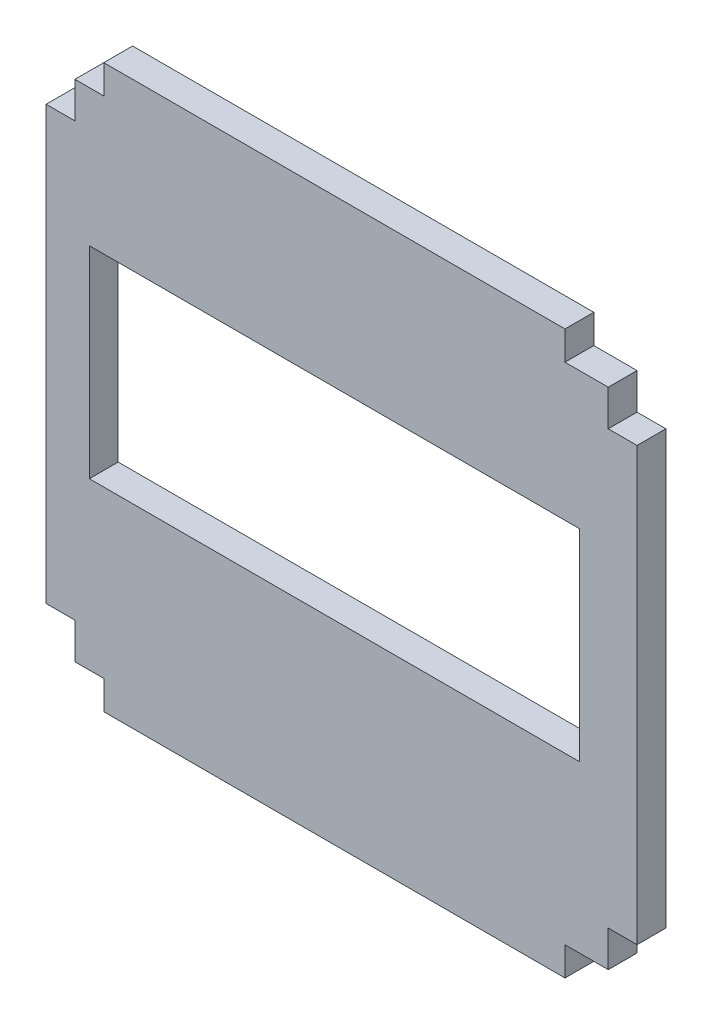
ISO-10303-21;
HEADER;
FILE_DESCRIPTION(('STEP AP214'),'2;1');
FILE_NAME('part.step','',(''),(''),'','','');
FILE_SCHEMA(('AUTOMOTIVE_DESIGN { 1 0 10303 214 1 1 1 1 }'));
ENDSEC;
DATA;
#1=APPLICATION_CONTEXT('core data for automotive mechanical design processes');
#2=APPLICATION_PROTOCOL_DEFINITION('international standard','automotive_design',2000,#1);
#3=PRODUCT_CONTEXT('',#1,'mechanical');
#4=PRODUCT('Part','Part','',(#3));
#5=PRODUCT_RELATED_PRODUCT_CATEGORY('part','',(#4));
#6=PRODUCT_DEFINITION_FORMATION('','',#4);
#7=PRODUCT_DEFINITION_CONTEXT('part definition',#1,'design');
#8=PRODUCT_DEFINITION('design','',#6,#7);
#9=PRODUCT_DEFINITION_SHAPE('','',#8);
#10=(LENGTH_UNIT() NAMED_UNIT(*) SI_UNIT(.MILLI.,.METRE.));
#11=(NAMED_UNIT(*) PLANE_ANGLE_UNIT() SI_UNIT($,.RADIAN.));
#12=(NAMED_UNIT(*) SI_UNIT($,.STERADIAN.) SOLID_ANGLE_UNIT());
#13=UNCERTAINTY_MEASURE_WITH_UNIT(LENGTH_MEASURE(1.E-05),#10,'distance_accuracy_value','');
#14=(GEOMETRIC_REPRESENTATION_CONTEXT(3) GLOBAL_UNCERTAINTY_ASSIGNED_CONTEXT((#13)) GLOBAL_UNIT_ASSIGNED_CONTEXT((#10,
#11,#12)) REPRESENTATION_CONTEXT('',''));
#15=CARTESIAN_POINT('',(0.,0.,0.));
#16=DIRECTION('',(0.,0.,1.));
#17=DIRECTION('',(1.,0.,0.));
#18=AXIS2_PLACEMENT_3D('',#15,#16,#17);
#19=CARTESIAN_POINT('',(0.,0.,2.));
#20=DIRECTION('',(0.,0.,-1.));
#21=DIRECTION('',(-1.,0.,0.));
#22=AXIS2_PLACEMENT_3D('',#19,#20,#21);
#23=PLANE('',#22);
#24=DIRECTION('',(0.,1.,0.));
#25=VECTOR('',#24,1.);
#26=CARTESIAN_POINT('',(37.,-32.5,2.));
#27=LINE('',#26,#25);
#28=CARTESIAN_POINT('',(37.,-35.,2.));
#29=VERTEX_POINT('',#28);
#30=CARTESIAN_POINT('',(37.,-32.5,2.));
#31=VERTEX_POINT('',#30);
#32=EDGE_CURVE('E231',#29,#31,#27,.T.);
#33=ORIENTED_EDGE('',*,*,#32,.T.);
#34=DIRECTION('',(1.,0.,0.));
#35=VECTOR('',#34,1.);
#36=CARTESIAN_POINT('',(37.,-32.5,2.));
#37=LINE('',#36,#35);
#38=CARTESIAN_POINT('',(39.,-32.5,2.));
#39=VERTEX_POINT('',#38);
#40=EDGE_CURVE('E234',#31,#39,#37,.T.);
#41=ORIENTED_EDGE('',*,*,#40,.T.);
#42=DIRECTION('',(0.,1.,0.));
#43=VECTOR('',#42,1.);
#44=CARTESIAN_POINT('',(39.,-32.5,2.));
#45=LINE('',#44,#43);
#46=CARTESIAN_POINT('',(39.,-2.5,2.));
#47=VERTEX_POINT('',#46);
#48=EDGE_CURVE('E237',#39,#47,#45,.T.);
#49=ORIENTED_EDGE('',*,*,#48,.T.);
#50=DIRECTION('',(-1.,0.,0.));
#51=VECTOR('',#50,1.);
#52=CARTESIAN_POINT('',(37.,-2.5,2.));
#53=LINE('',#52,#51);
#54=CARTESIAN_POINT('',(37.,-2.5,2.));
#55=VERTEX_POINT('',#54);
#56=EDGE_CURVE('E239',#47,#55,#53,.T.);
#57=ORIENTED_EDGE('',*,*,#56,.T.);
#58=DIRECTION('',(0.,1.,0.));
#59=VECTOR('',#58,1.);
#60=CARTESIAN_POINT('',(37.,-2.5,2.));
#61=LINE('',#60,#59);
#62=CARTESIAN_POINT('',(37.,0.,2.));
#63=VERTEX_POINT('',#62);
#64=EDGE_CURVE('E241',#55,#63,#61,.T.);
#65=ORIENTED_EDGE('',*,*,#64,.T.);
#66=DIRECTION('',(-1.,0.,0.));
#67=VECTOR('',#66,1.);
#68=CARTESIAN_POINT('',(37.,0.,2.));
#69=LINE('',#68,#67);
#70=CARTESIAN_POINT('',(34.,0.,2.));
#71=VERTEX_POINT('',#70);
#72=EDGE_CURVE('E243',#63,#71,#69,.T.);
#73=ORIENTED_EDGE('',*,*,#72,.T.);
#74=DIRECTION('',(0.,1.,0.));
#75=VECTOR('',#74,1.);
#76=CARTESIAN_POINT('',(34.,2.00000000000001,2.));
#77=LINE('',#76,#75);
#78=CARTESIAN_POINT('',(34.,2.00000000000001,2.));
#79=VERTEX_POINT('',#78);
#80=EDGE_CURVE('E245',#71,#79,#77,.T.);
#81=ORIENTED_EDGE('',*,*,#80,.T.);
#82=DIRECTION('',(-1.,0.,0.));
#83=VECTOR('',#82,1.);
#84=CARTESIAN_POINT('',(2.,2.00000000000001,2.));
#85=LINE('',#84,#83);
#86=CARTESIAN_POINT('',(2.,2.00000000000001,2.));
#87=VERTEX_POINT('',#86);
#88=EDGE_CURVE('E247',#79,#87,#85,.T.);
#89=ORIENTED_EDGE('',*,*,#88,.T.);
#90=DIRECTION('',(0.,-1.,0.));
#91=VECTOR('',#90,1.);
#92=CARTESIAN_POINT('',(2.,0.,2.));
#93=LINE('',#92,#91);
#94=CARTESIAN_POINT('',(2.,0.,2.));
#95=VERTEX_POINT('',#94);
#96=EDGE_CURVE('E249',#87,#95,#93,.T.);
#97=ORIENTED_EDGE('',*,*,#96,.T.);
#98=DIRECTION('',(-1.,0.,0.));
#99=VECTOR('',#98,1.);
#100=CARTESIAN_POINT('',(0.,0.,2.));
#101=LINE('',#100,#99);
#102=CARTESIAN_POINT('',(0.,0.,2.));
#103=VERTEX_POINT('',#102);
#104=EDGE_CURVE('E251',#95,#103,#101,.T.);
#105=ORIENTED_EDGE('',*,*,#104,.T.);
#106=DIRECTION('',(0.,-1.,0.));
#107=VECTOR('',#106,1.);
#108=CARTESIAN_POINT('',(0.,0.,2.));
#109=LINE('',#108,#107);
#110=CARTESIAN_POINT('',(0.,-2.5,2.));
#111=VERTEX_POINT('',#110);
#112=EDGE_CURVE('E253',#103,#111,#109,.T.);
#113=ORIENTED_EDGE('',*,*,#112,.T.);
#114=DIRECTION('',(-1.,0.,0.));
#115=VECTOR('',#114,1.);
#116=CARTESIAN_POINT('',(0.,-2.5,2.));
#117=LINE('',#116,#115);
#118=CARTESIAN_POINT('',(-2.,-2.5,2.));
#119=VERTEX_POINT('',#118);
#120=EDGE_CURVE('E255',#111,#119,#117,.T.);
#121=ORIENTED_EDGE('',*,*,#120,.T.);
#122=DIRECTION('',(0.,-1.,0.));
#123=VECTOR('',#122,1.);
#124=CARTESIAN_POINT('',(-2.,-2.5,2.));
#125=LINE('',#124,#123);
#126=CARTESIAN_POINT('',(-2.,-32.5,2.));
#127=VERTEX_POINT('',#126);
#128=EDGE_CURVE('E257',#119,#127,#125,.T.);
#129=ORIENTED_EDGE('',*,*,#128,.T.);
#130=DIRECTION('',(1.,0.,0.));
#131=VECTOR('',#130,1.);
#132=CARTESIAN_POINT('',(0.,-32.5,2.));
#133=LINE('',#132,#131);
#134=CARTESIAN_POINT('',(0.,-32.5,2.));
#135=VERTEX_POINT('',#134);
#136=EDGE_CURVE('E259',#127,#135,#133,.T.);
#137=ORIENTED_EDGE('',*,*,#136,.T.);
#138=DIRECTION('',(0.,-1.,0.));
#139=VECTOR('',#138,1.);
#140=CARTESIAN_POINT('',(0.,-35.,2.));
#141=LINE('',#140,#139);
#142=CARTESIAN_POINT('',(0.,-35.,2.));
#143=VERTEX_POINT('',#142);
#144=EDGE_CURVE('E261',#135,#143,#141,.T.);
#145=ORIENTED_EDGE('',*,*,#144,.T.);
#146=DIRECTION('',(1.,0.,0.));
#147=VECTOR('',#146,1.);
#148=CARTESIAN_POINT('',(0.,-35.,2.));
#149=LINE('',#148,#147);
#150=CARTESIAN_POINT('',(2.,-35.,2.));
#151=VERTEX_POINT('',#150);
#152=EDGE_CURVE('E263',#143,#151,#149,.T.);
#153=ORIENTED_EDGE('',*,*,#152,.T.);
#154=DIRECTION('',(0.,-1.,0.));
#155=VECTOR('',#154,1.);
#156=CARTESIAN_POINT('',(2.,-35.,2.));
#157=LINE('',#156,#155);
#158=CARTESIAN_POINT('',(2.,-37.,2.));
#159=VERTEX_POINT('',#158);
#160=EDGE_CURVE('E265',#151,#159,#157,.T.);
#161=ORIENTED_EDGE('',*,*,#160,.T.);
#162=DIRECTION('',(1.,0.,0.));
#163=VECTOR('',#162,1.);
#164=CARTESIAN_POINT('',(2.,-37.,2.));
#165=LINE('',#164,#163);
#166=CARTESIAN_POINT('',(34.,-37.,2.));
#167=VERTEX_POINT('',#166);
#168=EDGE_CURVE('E267',#159,#167,#165,.T.);
#169=ORIENTED_EDGE('',*,*,#168,.T.);
#170=DIRECTION('',(0.,1.,0.));
#171=VECTOR('',#170,1.);
#172=CARTESIAN_POINT('',(34.,-37.,2.));
#173=LINE('',#172,#171);
#174=CARTESIAN_POINT('',(34.,-35.,2.));
#175=VERTEX_POINT('',#174);
#176=EDGE_CURVE('E269',#167,#175,#173,.T.);
#177=ORIENTED_EDGE('',*,*,#176,.T.);
#178=DIRECTION('',(1.,0.,0.));
#179=VECTOR('',#178,1.);
#180=CARTESIAN_POINT('',(37.,-35.,2.));
#181=LINE('',#180,#179);
#182=EDGE_CURVE('E271',#175,#29,#181,.T.);
#183=ORIENTED_EDGE('',*,*,#182,.T.);
#184=EDGE_LOOP('',(#33,#41,#49,#57,#65,#73,#81,#89,#97,#105,#113,#121,#129,#137,#145,#153,#161,
#169,#177,#183));
#185=FACE_BOUND('',#184,.T.);
#186=DIRECTION('',(-1.,0.,0.));
#187=VECTOR('',#186,1.);
#188=CARTESIAN_POINT('',(35.0000000000001,-9.50000000000026,2.));
#189=LINE('',#188,#187);
#190=CARTESIAN_POINT('',(35.0000000000001,-9.50000000000026,2.));
#191=VERTEX_POINT('',#190);
#192=CARTESIAN_POINT('',(1.00000000000052,-9.50000000000026,2.));
#193=VERTEX_POINT('',#192);
#194=EDGE_CURVE('E198',#191,#193,#189,.T.);
#195=ORIENTED_EDGE('',*,*,#194,.F.);
#196=DIRECTION('',(0.,1.,0.));
#197=VECTOR('',#196,1.);
#198=CARTESIAN_POINT('',(35.0000000000001,-11.5000000000003,2.));
#199=LINE('',#198,#197);
#200=CARTESIAN_POINT('',(35.0000000000001,-23.5000000000002,2.));
#201=VERTEX_POINT('',#200);
#202=EDGE_CURVE('E193',#201,#191,#199,.T.);
#203=ORIENTED_EDGE('',*,*,#202,.F.);
#204=DIRECTION('',(1.,0.,0.));
#205=VECTOR('',#204,1.);
#206=CARTESIAN_POINT('',(1.00000000000052,-23.5000000000002,2.));
#207=LINE('',#206,#205);
#208=CARTESIAN_POINT('',(1.00000000000052,-23.5000000000002,2.));
#209=VERTEX_POINT('',#208);
#210=EDGE_CURVE('E214',#209,#201,#207,.T.);
#211=ORIENTED_EDGE('',*,*,#210,.F.);
#212=DIRECTION('',(0.,-1.,0.));
#213=VECTOR('',#212,1.);
#214=CARTESIAN_POINT('',(1.00000000000052,-9.50000000000026,2.));
#215=LINE('',#214,#213);
#216=EDGE_CURVE('E212',#193,#209,#215,.T.);
#217=ORIENTED_EDGE('',*,*,#216,.F.);
#218=EDGE_LOOP('',(#195,#203,#211,#217));
#219=FACE_BOUND('',#218,.T.);
#220=ADVANCED_FACE('F35',(#185,#219),#23,.F.);
#221=CARTESIAN_POINT('',(0.,0.,0.));
#222=DIRECTION('',(0.,0.,-1.));
#223=DIRECTION('',(-1.,0.,0.));
#224=AXIS2_PLACEMENT_3D('',#221,#222,#223);
#225=PLANE('',#224);
#226=DIRECTION('',(0.,1.,0.));
#227=VECTOR('',#226,1.);
#228=CARTESIAN_POINT('',(37.,-32.5,0.));
#229=LINE('',#228,#227);
#230=CARTESIAN_POINT('',(37.,-35.,0.));
#231=VERTEX_POINT('',#230);
#232=CARTESIAN_POINT('',(37.,-32.5,0.));
#233=VERTEX_POINT('',#232);
#234=EDGE_CURVE('E208',#231,#233,#229,.T.);
#235=ORIENTED_EDGE('',*,*,#234,.F.);
#236=DIRECTION('',(1.,0.,0.));
#237=VECTOR('',#236,1.);
#238=CARTESIAN_POINT('',(37.,-35.,0.));
#239=LINE('',#238,#237);
#240=CARTESIAN_POINT('',(34.,-35.,0.));
#241=VERTEX_POINT('',#240);
#242=EDGE_CURVE('E235',#241,#231,#239,.T.);
#243=ORIENTED_EDGE('',*,*,#242,.F.);
#244=DIRECTION('',(0.,1.,0.));
#245=VECTOR('',#244,1.);
#246=CARTESIAN_POINT('',(34.,-37.,0.));
#247=LINE('',#246,#245);
#248=CARTESIAN_POINT('',(34.,-37.,0.));
#249=VERTEX_POINT('',#248);
#250=EDGE_CURVE('E310',#249,#241,#247,.T.);
#251=ORIENTED_EDGE('',*,*,#250,.F.);
#252=DIRECTION('',(1.,0.,0.));
#253=VECTOR('',#252,1.);
#254=CARTESIAN_POINT('',(2.,-37.,0.));
#255=LINE('',#254,#253);
#256=CARTESIAN_POINT('',(2.,-37.,0.));
#257=VERTEX_POINT('',#256);
#258=EDGE_CURVE('E308',#257,#249,#255,.T.);
#259=ORIENTED_EDGE('',*,*,#258,.F.);
#260=DIRECTION('',(0.,-1.,0.));
#261=VECTOR('',#260,1.);
#262=CARTESIAN_POINT('',(2.,-35.,0.));
#263=LINE('',#262,#261);
#264=CARTESIAN_POINT('',(2.,-35.,0.));
#265=VERTEX_POINT('',#264);
#266=EDGE_CURVE('E306',#265,#257,#263,.T.);
#267=ORIENTED_EDGE('',*,*,#266,.F.);
#268=DIRECTION('',(1.,0.,0.));
#269=VECTOR('',#268,1.);
#270=CARTESIAN_POINT('',(0.,-35.,0.));
#271=LINE('',#270,#269);
#272=CARTESIAN_POINT('',(0.,-35.,0.));
#273=VERTEX_POINT('',#272);
#274=EDGE_CURVE('E304',#273,#265,#271,.T.);
#275=ORIENTED_EDGE('',*,*,#274,.F.);
#276=DIRECTION('',(0.,-1.,0.));
#277=VECTOR('',#276,1.);
#278=CARTESIAN_POINT('',(0.,-35.,0.));
#279=LINE('',#278,#277);
#280=CARTESIAN_POINT('',(0.,-32.5,0.));
#281=VERTEX_POINT('',#280);
#282=EDGE_CURVE('E302',#281,#273,#279,.T.);
#283=ORIENTED_EDGE('',*,*,#282,.F.);
#284=DIRECTION('',(1.,0.,0.));
#285=VECTOR('',#284,1.);
#286=CARTESIAN_POINT('',(0.,-32.5,0.));
#287=LINE('',#286,#285);
#288=CARTESIAN_POINT('',(-2.,-32.5,0.));
#289=VERTEX_POINT('',#288);
#290=EDGE_CURVE('E300',#289,#281,#287,.T.);
#291=ORIENTED_EDGE('',*,*,#290,.F.);
#292=DIRECTION('',(0.,-1.,0.));
#293=VECTOR('',#292,1.);
#294=CARTESIAN_POINT('',(-2.,-2.5,0.));
#295=LINE('',#294,#293);
#296=CARTESIAN_POINT('',(-2.,-2.5,0.));
#297=VERTEX_POINT('',#296);
#298=EDGE_CURVE('E298',#297,#289,#295,.T.);
#299=ORIENTED_EDGE('',*,*,#298,.F.);
#300=DIRECTION('',(-1.,0.,0.));
#301=VECTOR('',#300,1.);
#302=CARTESIAN_POINT('',(0.,-2.5,0.));
#303=LINE('',#302,#301);
#304=CARTESIAN_POINT('',(0.,-2.5,0.));
#305=VERTEX_POINT('',#304);
#306=EDGE_CURVE('E296',#305,#297,#303,.T.);
#307=ORIENTED_EDGE('',*,*,#306,.F.);
#308=DIRECTION('',(0.,-1.,0.));
#309=VECTOR('',#308,1.);
#310=CARTESIAN_POINT('',(0.,0.,0.));
#311=LINE('',#310,#309);
#312=CARTESIAN_POINT('',(0.,0.,0.));
#313=VERTEX_POINT('',#312);
#314=EDGE_CURVE('E294',#313,#305,#311,.T.);
#315=ORIENTED_EDGE('',*,*,#314,.F.);
#316=DIRECTION('',(-1.,0.,0.));
#317=VECTOR('',#316,1.);
#318=CARTESIAN_POINT('',(0.,0.,0.));
#319=LINE('',#318,#317);
#320=CARTESIAN_POINT('',(2.,0.,0.));
#321=VERTEX_POINT('',#320);
#322=EDGE_CURVE('E292',#321,#313,#319,.T.);
#323=ORIENTED_EDGE('',*,*,#322,.F.);
#324=DIRECTION('',(0.,-1.,0.));
#325=VECTOR('',#324,1.);
#326=CARTESIAN_POINT('',(2.,0.,0.));
#327=LINE('',#326,#325);
#328=CARTESIAN_POINT('',(2.,2.00000000000001,0.));
#329=VERTEX_POINT('',#328);
#330=EDGE_CURVE('E290',#329,#321,#327,.T.);
#331=ORIENTED_EDGE('',*,*,#330,.F.);
#332=DIRECTION('',(-1.,0.,0.));
#333=VECTOR('',#332,1.);
#334=CARTESIAN_POINT('',(2.,2.00000000000001,0.));
#335=LINE('',#334,#333);
#336=CARTESIAN_POINT('',(34.,2.00000000000001,0.));
#337=VERTEX_POINT('',#336);
#338=EDGE_CURVE('E288',#337,#329,#335,.T.);
#339=ORIENTED_EDGE('',*,*,#338,.F.);
#340=DIRECTION('',(0.,1.,0.));
#341=VECTOR('',#340,1.);
#342=CARTESIAN_POINT('',(34.,2.00000000000001,0.));
#343=LINE('',#342,#341);
#344=CARTESIAN_POINT('',(34.,0.,0.));
#345=VERTEX_POINT('',#344);
#346=EDGE_CURVE('E286',#345,#337,#343,.T.);
#347=ORIENTED_EDGE('',*,*,#346,.F.);
#348=DIRECTION('',(-1.,0.,0.));
#349=VECTOR('',#348,1.);
#350=CARTESIAN_POINT('',(37.,0.,0.));
#351=LINE('',#350,#349);
#352=CARTESIAN_POINT('',(37.,0.,0.));
#353=VERTEX_POINT('',#352);
#354=EDGE_CURVE('E284',#353,#345,#351,.T.);
#355=ORIENTED_EDGE('',*,*,#354,.F.);
#356=DIRECTION('',(0.,1.,0.));
#357=VECTOR('',#356,1.);
#358=CARTESIAN_POINT('',(37.,-2.5,0.));
#359=LINE('',#358,#357);
#360=CARTESIAN_POINT('',(37.,-2.5,0.));
#361=VERTEX_POINT('',#360);
#362=EDGE_CURVE('E282',#361,#353,#359,.T.);
#363=ORIENTED_EDGE('',*,*,#362,.F.);
#364=DIRECTION('',(-1.,0.,0.));
#365=VECTOR('',#364,1.);
#366=CARTESIAN_POINT('',(37.,-2.5,0.));
#367=LINE('',#366,#365);
#368=CARTESIAN_POINT('',(39.,-2.5,0.));
#369=VERTEX_POINT('',#368);
#370=EDGE_CURVE('E280',#369,#361,#367,.T.);
#371=ORIENTED_EDGE('',*,*,#370,.F.);
#372=DIRECTION('',(0.,1.,0.));
#373=VECTOR('',#372,1.);
#374=CARTESIAN_POINT('',(39.,-32.5,0.));
#375=LINE('',#374,#373);
#376=CARTESIAN_POINT('',(39.,-32.5,0.));
#377=VERTEX_POINT('',#376);
#378=EDGE_CURVE('E278',#377,#369,#375,.T.);
#379=ORIENTED_EDGE('',*,*,#378,.F.);
#380=DIRECTION('',(1.,0.,0.));
#381=VECTOR('',#380,1.);
#382=CARTESIAN_POINT('',(37.,-32.5,0.));
#383=LINE('',#382,#381);
#384=EDGE_CURVE('E276',#233,#377,#383,.T.);
#385=ORIENTED_EDGE('',*,*,#384,.F.);
#386=EDGE_LOOP('',(#235,#243,#251,#259,#267,#275,#283,#291,#299,#307,#315,#323,#331,#339,#347,
#355,#363,#371,#379,#385));
#387=FACE_BOUND('',#386,.T.);
#388=DIRECTION('',(0.,1.,0.));
#389=VECTOR('',#388,1.);
#390=CARTESIAN_POINT('',(35.0000000000001,-11.5000000000003,0.));
#391=LINE('',#390,#389);
#392=CARTESIAN_POINT('',(35.0000000000001,-23.5000000000002,0.));
#393=VERTEX_POINT('',#392);
#394=CARTESIAN_POINT('',(35.0000000000001,-9.50000000000026,0.));
#395=VERTEX_POINT('',#394);
#396=EDGE_CURVE('E199',#393,#395,#391,.T.);
#397=ORIENTED_EDGE('',*,*,#396,.T.);
#398=DIRECTION('',(-1.,0.,0.));
#399=VECTOR('',#398,1.);
#400=CARTESIAN_POINT('',(35.0000000000001,-9.50000000000026,0.));
#401=LINE('',#400,#399);
#402=CARTESIAN_POINT('',(1.00000000000052,-9.50000000000026,0.));
#403=VERTEX_POINT('',#402);
#404=EDGE_CURVE('E206',#395,#403,#401,.T.);
#405=ORIENTED_EDGE('',*,*,#404,.T.);
#406=DIRECTION('',(0.,-1.,0.));
#407=VECTOR('',#406,1.);
#408=CARTESIAN_POINT('',(1.00000000000052,-11.5000000000003,0.));
#409=LINE('',#408,#407);
#410=CARTESIAN_POINT('',(1.00000000000052,-23.5000000000002,0.));
#411=VERTEX_POINT('',#410);
#412=EDGE_CURVE('E219',#403,#411,#409,.T.);
#413=ORIENTED_EDGE('',*,*,#412,.T.);
#414=DIRECTION('',(1.,0.,0.));
#415=VECTOR('',#414,1.);
#416=CARTESIAN_POINT('',(35.0000000000001,-23.5000000000002,0.));
#417=LINE('',#416,#415);
#418=EDGE_CURVE('E222',#411,#393,#417,.T.);
#419=ORIENTED_EDGE('',*,*,#418,.T.);
#420=EDGE_LOOP('',(#397,#405,#413,#419));
#421=FACE_BOUND('',#420,.T.);
#422=ADVANCED_FACE('F376',(#387,#421),#225,.T.);
#423=CARTESIAN_POINT('',(37.,-32.5,2.));
#424=DIRECTION('',(-1.,0.,0.));
#425=DIRECTION('',(0.,0.,1.));
#426=AXIS2_PLACEMENT_3D('',#423,#424,#425);
#427=PLANE('',#426);
#428=ORIENTED_EDGE('',*,*,#234,.T.);
#429=DIRECTION('',(0.,0.,-1.));
#430=VECTOR('',#429,1.);
#431=CARTESIAN_POINT('',(37.,-32.5,2.));
#432=LINE('',#431,#430);
#433=EDGE_CURVE('E11',#31,#233,#432,.T.);
#434=ORIENTED_EDGE('',*,*,#433,.F.);
#435=ORIENTED_EDGE('',*,*,#32,.F.);
#436=DIRECTION('',(0.,0.,-1.));
#437=VECTOR('',#436,1.);
#438=CARTESIAN_POINT('',(37.,-35.,2.));
#439=LINE('',#438,#437);
#440=EDGE_CURVE('E273',#29,#231,#439,.T.);
#441=ORIENTED_EDGE('',*,*,#440,.T.);
#442=EDGE_LOOP('',(#428,#434,#435,#441));
#443=FACE_BOUND('',#442,.T.);
#444=ADVANCED_FACE('F37',(#443),#427,.F.);
#445=CARTESIAN_POINT('',(37.,-32.5,2.));
#446=DIRECTION('',(0.,1.,0.));
#447=DIRECTION('',(0.,0.,1.));
#448=AXIS2_PLACEMENT_3D('',#445,#446,#447);
#449=PLANE('',#448);
#450=ORIENTED_EDGE('',*,*,#384,.T.);
#451=DIRECTION('',(0.,0.,-1.));
#452=VECTOR('',#451,1.);
#453=CARTESIAN_POINT('',(39.,-32.5,2.));
#454=LINE('',#453,#452);
#455=EDGE_CURVE('E43',#39,#377,#454,.T.);
#456=ORIENTED_EDGE('',*,*,#455,.F.);
#457=ORIENTED_EDGE('',*,*,#40,.F.);
#458=ORIENTED_EDGE('',*,*,#433,.T.);
#459=EDGE_LOOP('',(#450,#456,#457,#458));
#460=FACE_BOUND('',#459,.T.);
#461=ADVANCED_FACE('F393',(#460),#449,.F.);
#462=CARTESIAN_POINT('',(39.,-32.5,2.));
#463=DIRECTION('',(-1.,0.,0.));
#464=DIRECTION('',(0.,0.,1.));
#465=AXIS2_PLACEMENT_3D('',#462,#463,#464);
#466=PLANE('',#465);
#467=ORIENTED_EDGE('',*,*,#378,.T.);
#468=DIRECTION('',(0.,0.,-1.));
#469=VECTOR('',#468,1.);
#470=CARTESIAN_POINT('',(39.,-2.5,2.));
#471=LINE('',#470,#469);
#472=EDGE_CURVE('E363',#47,#369,#471,.T.);
#473=ORIENTED_EDGE('',*,*,#472,.F.);
#474=ORIENTED_EDGE('',*,*,#48,.F.);
#475=ORIENTED_EDGE('',*,*,#455,.T.);
#476=EDGE_LOOP('',(#467,#473,#474,#475));
#477=FACE_BOUND('',#476,.T.);
#478=ADVANCED_FACE('F370',(#477),#466,.F.);
#479=CARTESIAN_POINT('',(37.,-2.5,2.));
#480=DIRECTION('',(0.,-1.,0.));
#481=DIRECTION('',(0.,0.,-1.));
#482=AXIS2_PLACEMENT_3D('',#479,#480,#481);
#483=PLANE('',#482);
#484=ORIENTED_EDGE('',*,*,#370,.T.);
#485=DIRECTION('',(0.,0.,-1.));
#486=VECTOR('',#485,1.);
#487=CARTESIAN_POINT('',(37.,-2.5,2.));
#488=LINE('',#487,#486);
#489=EDGE_CURVE('E360',#55,#361,#488,.T.);
#490=ORIENTED_EDGE('',*,*,#489,.F.);
#491=ORIENTED_EDGE('',*,*,#56,.F.);
#492=ORIENTED_EDGE('',*,*,#472,.T.);
#493=EDGE_LOOP('',(#484,#490,#491,#492));
#494=FACE_BOUND('',#493,.T.);
#495=ADVANCED_FACE('F382',(#494),#483,.F.);
#496=CARTESIAN_POINT('',(37.,-2.5,2.));
#497=DIRECTION('',(-1.,0.,0.));
#498=DIRECTION('',(0.,0.,1.));
#499=AXIS2_PLACEMENT_3D('',#496,#497,#498);
#500=PLANE('',#499);
#501=ORIENTED_EDGE('',*,*,#362,.T.);
#502=DIRECTION('',(0.,0.,-1.));
#503=VECTOR('',#502,1.);
#504=CARTESIAN_POINT('',(37.,0.,2.));
#505=LINE('',#504,#503);
#506=EDGE_CURVE('E357',#63,#353,#505,.T.);
#507=ORIENTED_EDGE('',*,*,#506,.F.);
#508=ORIENTED_EDGE('',*,*,#64,.F.);
#509=ORIENTED_EDGE('',*,*,#489,.T.);
#510=EDGE_LOOP('',(#501,#507,#508,#509));
#511=FACE_BOUND('',#510,.T.);
#512=ADVANCED_FACE('F386',(#511),#500,.F.);
#513=CARTESIAN_POINT('',(37.,0.,2.));
#514=DIRECTION('',(0.,-1.,0.));
#515=DIRECTION('',(0.,0.,-1.));
#516=AXIS2_PLACEMENT_3D('',#513,#514,#515);
#517=PLANE('',#516);
#518=ORIENTED_EDGE('',*,*,#354,.T.);
#519=DIRECTION('',(0.,0.,-1.));
#520=VECTOR('',#519,1.);
#521=CARTESIAN_POINT('',(34.,0.,2.));
#522=LINE('',#521,#520);
#523=EDGE_CURVE('E354',#71,#345,#522,.T.);
#524=ORIENTED_EDGE('',*,*,#523,.F.);
#525=ORIENTED_EDGE('',*,*,#72,.F.);
#526=ORIENTED_EDGE('',*,*,#506,.T.);
#527=EDGE_LOOP('',(#518,#524,#525,#526));
#528=FACE_BOUND('',#527,.T.);
#529=ADVANCED_FACE('F466',(#528),#517,.F.);
#530=CARTESIAN_POINT('',(34.,2.00000000000001,2.));
#531=DIRECTION('',(-1.,0.,0.));
#532=DIRECTION('',(0.,0.,1.));
#533=AXIS2_PLACEMENT_3D('',#530,#531,#532);
#534=PLANE('',#533);
#535=ORIENTED_EDGE('',*,*,#346,.T.);
#536=DIRECTION('',(0.,0.,-1.));
#537=VECTOR('',#536,1.);
#538=CARTESIAN_POINT('',(34.,2.00000000000001,2.));
#539=LINE('',#538,#537);
#540=EDGE_CURVE('E351',#79,#337,#539,.T.);
#541=ORIENTED_EDGE('',*,*,#540,.F.);
#542=ORIENTED_EDGE('',*,*,#80,.F.);
#543=ORIENTED_EDGE('',*,*,#523,.T.);
#544=EDGE_LOOP('',(#535,#541,#542,#543));
#545=FACE_BOUND('',#544,.T.);
#546=ADVANCED_FACE('F464',(#545),#534,.F.);
#547=CARTESIAN_POINT('',(2.,2.00000000000001,2.));
#548=DIRECTION('',(0.,-1.,0.));
#549=DIRECTION('',(0.,0.,-1.));
#550=AXIS2_PLACEMENT_3D('',#547,#548,#549);
#551=PLANE('',#550);
#552=ORIENTED_EDGE('',*,*,#338,.T.);
#553=DIRECTION('',(0.,0.,-1.));
#554=VECTOR('',#553,1.);
#555=CARTESIAN_POINT('',(2.,2.00000000000001,2.));
#556=LINE('',#555,#554);
#557=EDGE_CURVE('E348',#87,#329,#556,.T.);
#558=ORIENTED_EDGE('',*,*,#557,.F.);
#559=ORIENTED_EDGE('',*,*,#88,.F.);
#560=ORIENTED_EDGE('',*,*,#540,.T.);
#561=EDGE_LOOP('',(#552,#558,#559,#560));
#562=FACE_BOUND('',#561,.T.);
#563=ADVANCED_FACE('F459',(#562),#551,.F.);
#564=CARTESIAN_POINT('',(2.,0.,2.));
#565=DIRECTION('',(1.,0.,0.));
#566=DIRECTION('',(0.,1.,0.));
#567=AXIS2_PLACEMENT_3D('',#564,#565,#566);
#568=PLANE('',#567);
#569=ORIENTED_EDGE('',*,*,#330,.T.);
#570=DIRECTION('',(0.,0.,-1.));
#571=VECTOR('',#570,1.);
#572=CARTESIAN_POINT('',(2.,0.,2.));
#573=LINE('',#572,#571);
#574=EDGE_CURVE('E345',#95,#321,#573,.T.);
#575=ORIENTED_EDGE('',*,*,#574,.F.);
#576=ORIENTED_EDGE('',*,*,#96,.F.);
#577=ORIENTED_EDGE('',*,*,#557,.T.);
#578=EDGE_LOOP('',(#569,#575,#576,#577));
#579=FACE_BOUND('',#578,.T.);
#580=ADVANCED_FACE('F454',(#579),#568,.F.);
#581=CARTESIAN_POINT('',(0.,0.,2.));
#582=DIRECTION('',(0.,-1.,0.));
#583=DIRECTION('',(0.,0.,-1.));
#584=AXIS2_PLACEMENT_3D('',#581,#582,#583);
#585=PLANE('',#584);
#586=ORIENTED_EDGE('',*,*,#322,.T.);
#587=DIRECTION('',(0.,0.,-1.));
#588=VECTOR('',#587,1.);
#589=CARTESIAN_POINT('',(0.,0.,2.));
#590=LINE('',#589,#588);
#591=EDGE_CURVE('E342',#103,#313,#590,.T.);
#592=ORIENTED_EDGE('',*,*,#591,.F.);
#593=ORIENTED_EDGE('',*,*,#104,.F.);
#594=ORIENTED_EDGE('',*,*,#574,.T.);
#595=EDGE_LOOP('',(#586,#592,#593,#594));
#596=FACE_BOUND('',#595,.T.);
#597=ADVANCED_FACE('F450',(#596),#585,.F.);
#598=CARTESIAN_POINT('',(0.,0.,2.));
#599=DIRECTION('',(1.,0.,0.));
#600=DIRECTION('',(0.,1.,0.));
#601=AXIS2_PLACEMENT_3D('',#598,#599,#600);
#602=PLANE('',#601);
#603=ORIENTED_EDGE('',*,*,#314,.T.);
#604=DIRECTION('',(0.,0.,-1.));
#605=VECTOR('',#604,1.);
#606=CARTESIAN_POINT('',(0.,-2.5,2.));
#607=LINE('',#606,#605);
#608=EDGE_CURVE('E339',#111,#305,#607,.T.);
#609=ORIENTED_EDGE('',*,*,#608,.F.);
#610=ORIENTED_EDGE('',*,*,#112,.F.);
#611=ORIENTED_EDGE('',*,*,#591,.T.);
#612=EDGE_LOOP('',(#603,#609,#610,#611));
#613=FACE_BOUND('',#612,.T.);
#614=ADVANCED_FACE('F445',(#613),#602,.F.);
#615=CARTESIAN_POINT('',(0.,-2.5,2.));
#616=DIRECTION('',(0.,-1.,0.));
#617=DIRECTION('',(0.,0.,-1.));
#618=AXIS2_PLACEMENT_3D('',#615,#616,#617);
#619=PLANE('',#618);
#620=ORIENTED_EDGE('',*,*,#306,.T.);
#621=DIRECTION('',(0.,0.,-1.));
#622=VECTOR('',#621,1.);
#623=CARTESIAN_POINT('',(-2.,-2.5,2.));
#624=LINE('',#623,#622);
#625=EDGE_CURVE('E336',#119,#297,#624,.T.);
#626=ORIENTED_EDGE('',*,*,#625,.F.);
#627=ORIENTED_EDGE('',*,*,#120,.F.);
#628=ORIENTED_EDGE('',*,*,#608,.T.);
#629=EDGE_LOOP('',(#620,#626,#627,#628));
#630=FACE_BOUND('',#629,.T.);
#631=ADVANCED_FACE('F439',(#630),#619,.F.);
#632=CARTESIAN_POINT('',(-2.,-2.5,2.));
#633=DIRECTION('',(1.,0.,0.));
#634=DIRECTION('',(0.,0.,-1.));
#635=AXIS2_PLACEMENT_3D('',#632,#633,#634);
#636=PLANE('',#635);
#637=ORIENTED_EDGE('',*,*,#298,.T.);
#638=DIRECTION('',(0.,0.,-1.));
#639=VECTOR('',#638,1.);
#640=CARTESIAN_POINT('',(-2.,-32.5,2.));
#641=LINE('',#640,#639);
#642=EDGE_CURVE('E333',#127,#289,#641,.T.);
#643=ORIENTED_EDGE('',*,*,#642,.F.);
#644=ORIENTED_EDGE('',*,*,#128,.F.);
#645=ORIENTED_EDGE('',*,*,#625,.T.);
#646=EDGE_LOOP('',(#637,#643,#644,#645));
#647=FACE_BOUND('',#646,.T.);
#648=ADVANCED_FACE('F435',(#647),#636,.F.);
#649=CARTESIAN_POINT('',(0.,-32.5,2.));
#650=DIRECTION('',(0.,1.,0.));
#651=DIRECTION('',(0.,0.,1.));
#652=AXIS2_PLACEMENT_3D('',#649,#650,#651);
#653=PLANE('',#652);
#654=ORIENTED_EDGE('',*,*,#290,.T.);
#655=DIRECTION('',(0.,0.,-1.));
#656=VECTOR('',#655,1.);
#657=CARTESIAN_POINT('',(0.,-32.5,2.));
#658=LINE('',#657,#656);
#659=EDGE_CURVE('E330',#135,#281,#658,.T.);
#660=ORIENTED_EDGE('',*,*,#659,.F.);
#661=ORIENTED_EDGE('',*,*,#136,.F.);
#662=ORIENTED_EDGE('',*,*,#642,.T.);
#663=EDGE_LOOP('',(#654,#660,#661,#662));
#664=FACE_BOUND('',#663,.T.);
#665=ADVANCED_FACE('F430',(#664),#653,.F.);
#666=CARTESIAN_POINT('',(0.,-35.,2.));
#667=DIRECTION('',(1.,0.,0.));
#668=DIRECTION('',(0.,1.,0.));
#669=AXIS2_PLACEMENT_3D('',#666,#667,#668);
#670=PLANE('',#669);
#671=ORIENTED_EDGE('',*,*,#282,.T.);
#672=DIRECTION('',(0.,0.,-1.));
#673=VECTOR('',#672,1.);
#674=CARTESIAN_POINT('',(0.,-35.,2.));
#675=LINE('',#674,#673);
#676=EDGE_CURVE('E327',#143,#273,#675,.T.);
#677=ORIENTED_EDGE('',*,*,#676,.F.);
#678=ORIENTED_EDGE('',*,*,#144,.F.);
#679=ORIENTED_EDGE('',*,*,#659,.T.);
#680=EDGE_LOOP('',(#671,#677,#678,#679));
#681=FACE_BOUND('',#680,.T.);
#682=ADVANCED_FACE('F424',(#681),#670,.F.);
#683=CARTESIAN_POINT('',(0.,-35.,2.));
#684=DIRECTION('',(0.,1.,0.));
#685=DIRECTION('',(0.,0.,1.));
#686=AXIS2_PLACEMENT_3D('',#683,#684,#685);
#687=PLANE('',#686);
#688=ORIENTED_EDGE('',*,*,#274,.T.);
#689=DIRECTION('',(0.,0.,-1.));
#690=VECTOR('',#689,1.);
#691=CARTESIAN_POINT('',(2.,-35.,2.));
#692=LINE('',#691,#690);
#693=EDGE_CURVE('E324',#151,#265,#692,.T.);
#694=ORIENTED_EDGE('',*,*,#693,.F.);
#695=ORIENTED_EDGE('',*,*,#152,.F.);
#696=ORIENTED_EDGE('',*,*,#676,.T.);
#697=EDGE_LOOP('',(#688,#694,#695,#696));
#698=FACE_BOUND('',#697,.T.);
#699=ADVANCED_FACE('F420',(#698),#687,.F.);
#700=CARTESIAN_POINT('',(2.,-35.,2.));
#701=DIRECTION('',(1.,0.,0.));
#702=DIRECTION('',(0.,1.,0.));
#703=AXIS2_PLACEMENT_3D('',#700,#701,#702);
#704=PLANE('',#703);
#705=ORIENTED_EDGE('',*,*,#266,.T.);
#706=DIRECTION('',(0.,0.,-1.));
#707=VECTOR('',#706,1.);
#708=CARTESIAN_POINT('',(2.,-37.,2.));
#709=LINE('',#708,#707);
#710=EDGE_CURVE('E321',#159,#257,#709,.T.);
#711=ORIENTED_EDGE('',*,*,#710,.F.);
#712=ORIENTED_EDGE('',*,*,#160,.F.);
#713=ORIENTED_EDGE('',*,*,#693,.T.);
#714=EDGE_LOOP('',(#705,#711,#712,#713));
#715=FACE_BOUND('',#714,.T.);
#716=ADVANCED_FACE('F415',(#715),#704,.F.);
#717=CARTESIAN_POINT('',(2.,-37.,2.));
#718=DIRECTION('',(0.,1.,0.));
#719=DIRECTION('',(0.,0.,1.));
#720=AXIS2_PLACEMENT_3D('',#717,#718,#719);
#721=PLANE('',#720);
#722=ORIENTED_EDGE('',*,*,#258,.T.);
#723=DIRECTION('',(0.,0.,-1.));
#724=VECTOR('',#723,1.);
#725=CARTESIAN_POINT('',(34.,-37.,2.));
#726=LINE('',#725,#724);
#727=EDGE_CURVE('E318',#167,#249,#726,.T.);
#728=ORIENTED_EDGE('',*,*,#727,.F.);
#729=ORIENTED_EDGE('',*,*,#168,.F.);
#730=ORIENTED_EDGE('',*,*,#710,.T.);
#731=EDGE_LOOP('',(#722,#728,#729,#730));
#732=FACE_BOUND('',#731,.T.);
#733=ADVANCED_FACE('F409',(#732),#721,.F.);
#734=CARTESIAN_POINT('',(34.,-37.,2.));
#735=DIRECTION('',(-1.,0.,0.));
#736=DIRECTION('',(0.,0.,1.));
#737=AXIS2_PLACEMENT_3D('',#734,#735,#736);
#738=PLANE('',#737);
#739=ORIENTED_EDGE('',*,*,#250,.T.);
#740=DIRECTION('',(0.,0.,-1.));
#741=VECTOR('',#740,1.);
#742=CARTESIAN_POINT('',(34.,-35.,2.));
#743=LINE('',#742,#741);
#744=EDGE_CURVE('E315',#175,#241,#743,.T.);
#745=ORIENTED_EDGE('',*,*,#744,.F.);
#746=ORIENTED_EDGE('',*,*,#176,.F.);
#747=ORIENTED_EDGE('',*,*,#727,.T.);
#748=EDGE_LOOP('',(#739,#745,#746,#747));
#749=FACE_BOUND('',#748,.T.);
#750=ADVANCED_FACE('F405',(#749),#738,.F.);
#751=CARTESIAN_POINT('',(37.,-35.,2.));
#752=DIRECTION('',(0.,1.,0.));
#753=DIRECTION('',(0.,0.,1.));
#754=AXIS2_PLACEMENT_3D('',#751,#752,#753);
#755=PLANE('',#754);
#756=ORIENTED_EDGE('',*,*,#242,.T.);
#757=ORIENTED_EDGE('',*,*,#440,.F.);
#758=ORIENTED_EDGE('',*,*,#182,.F.);
#759=ORIENTED_EDGE('',*,*,#744,.T.);
#760=EDGE_LOOP('',(#756,#757,#758,#759));
#761=FACE_BOUND('',#760,.T.);
#762=ADVANCED_FACE('F400',(#761),#755,.F.);
#763=CARTESIAN_POINT('',(35.0000000000001,-9.50000000000026,2.));
#764=DIRECTION('',(0.,-1.,0.));
#765=DIRECTION('',(0.,0.,-1.));
#766=AXIS2_PLACEMENT_3D('',#763,#764,#765);
#767=PLANE('',#766);
#768=ORIENTED_EDGE('',*,*,#404,.F.);
#769=DIRECTION('',(0.,0.,-1.));
#770=VECTOR('',#769,1.);
#771=CARTESIAN_POINT('',(35.0000000000001,-9.50000000000026,2.));
#772=LINE('',#771,#770);
#773=EDGE_CURVE('E55',#191,#395,#772,.T.);
#774=ORIENTED_EDGE('',*,*,#773,.F.);
#775=ORIENTED_EDGE('',*,*,#194,.T.);
#776=DIRECTION('',(0.,0.,-1.));
#777=VECTOR('',#776,1.);
#778=CARTESIAN_POINT('',(1.00000000000052,-9.50000000000026,2.));
#779=LINE('',#778,#777);
#780=EDGE_CURVE('E209',#193,#403,#779,.T.);
#781=ORIENTED_EDGE('',*,*,#780,.T.);
#782=EDGE_LOOP('',(#768,#774,#775,#781));
#783=FACE_BOUND('',#782,.T.);
#784=ADVANCED_FACE('F202',(#783),#767,.T.);
#785=CARTESIAN_POINT('',(1.00000000000052,-11.5000000000003,2.));
#786=DIRECTION('',(1.,0.,0.));
#787=DIRECTION('',(0.,1.,0.));
#788=AXIS2_PLACEMENT_3D('',#785,#786,#787);
#789=PLANE('',#788);
#790=ORIENTED_EDGE('',*,*,#412,.F.);
#791=ORIENTED_EDGE('',*,*,#780,.F.);
#792=ORIENTED_EDGE('',*,*,#216,.T.);
#793=DIRECTION('',(0.,0.,-1.));
#794=VECTOR('',#793,1.);
#795=CARTESIAN_POINT('',(1.00000000000052,-23.5000000000002,2.));
#796=LINE('',#795,#794);
#797=EDGE_CURVE('E227',#209,#411,#796,.T.);
#798=ORIENTED_EDGE('',*,*,#797,.T.);
#799=EDGE_LOOP('',(#790,#791,#792,#798));
#800=FACE_BOUND('',#799,.T.);
#801=ADVANCED_FACE('F567',(#800),#789,.T.);
#802=CARTESIAN_POINT('',(35.0000000000001,-23.5000000000002,2.));
#803=DIRECTION('',(0.,1.,0.));
#804=DIRECTION('',(0.,0.,1.));
#805=AXIS2_PLACEMENT_3D('',#802,#803,#804);
#806=PLANE('',#805);
#807=ORIENTED_EDGE('',*,*,#418,.F.);
#808=ORIENTED_EDGE('',*,*,#797,.F.);
#809=ORIENTED_EDGE('',*,*,#210,.T.);
#810=DIRECTION('',(0.,0.,-1.));
#811=VECTOR('',#810,1.);
#812=CARTESIAN_POINT('',(35.0000000000001,-23.5000000000002,2.));
#813=LINE('',#812,#811);
#814=EDGE_CURVE('E50',#201,#393,#813,.T.);
#815=ORIENTED_EDGE('',*,*,#814,.T.);
#816=EDGE_LOOP('',(#807,#808,#809,#815));
#817=FACE_BOUND('',#816,.T.);
#818=ADVANCED_FACE('F573',(#817),#806,.T.);
#819=CARTESIAN_POINT('',(35.0000000000001,-11.5000000000003,2.));
#820=DIRECTION('',(-1.,0.,0.));
#821=DIRECTION('',(0.,0.,1.));
#822=AXIS2_PLACEMENT_3D('',#819,#820,#821);
#823=PLANE('',#822);
#824=ORIENTED_EDGE('',*,*,#396,.F.);
#825=ORIENTED_EDGE('',*,*,#814,.F.);
#826=ORIENTED_EDGE('',*,*,#202,.T.);
#827=ORIENTED_EDGE('',*,*,#773,.T.);
#828=EDGE_LOOP('',(#824,#825,#826,#827));
#829=FACE_BOUND('',#828,.T.);
#830=ADVANCED_FACE('F194',(#829),#823,.T.);
#831=CLOSED_SHELL('',(#220,#422,#444,#461,#478,#495,#512,#529,#546,#563,#580,#597,#614,#631,
#648,#665,#682,#699,#716,#733,#750,#762,#784,#801,#818,#830));
#832=MANIFOLD_SOLID_BREP('B2',#831);
#833=ADVANCED_BREP_SHAPE_REPRESENTATION('',(#18,#832),#14);
#834=SHAPE_DEFINITION_REPRESENTATION(#9,#833);
ENDSEC;
END-ISO-10303-21;
